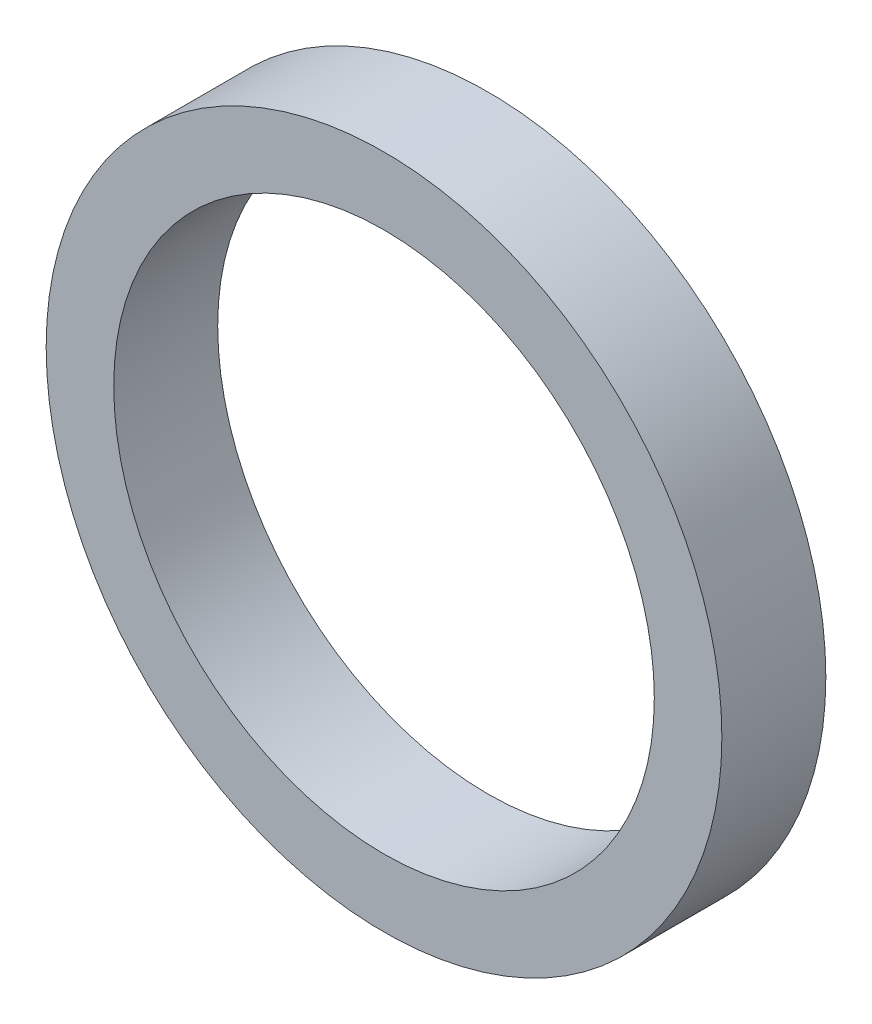
ISO-10303-21;
HEADER;
FILE_DESCRIPTION(('STEP AP214'),'2;1');
FILE_NAME('part.step','',(''),(''),'','','');
FILE_SCHEMA(('AUTOMOTIVE_DESIGN { 1 0 10303 214 1 1 1 1 }'));
ENDSEC;
DATA;
#1=APPLICATION_CONTEXT('core data for automotive mechanical design processes');
#2=APPLICATION_PROTOCOL_DEFINITION('international standard','automotive_design',2000,#1);
#3=PRODUCT_CONTEXT('',#1,'mechanical');
#4=PRODUCT('Part','Part','',(#3));
#5=PRODUCT_RELATED_PRODUCT_CATEGORY('part','',(#4));
#6=PRODUCT_DEFINITION_FORMATION('','',#4);
#7=PRODUCT_DEFINITION_CONTEXT('part definition',#1,'design');
#8=PRODUCT_DEFINITION('design','',#6,#7);
#9=PRODUCT_DEFINITION_SHAPE('','',#8);
#10=(LENGTH_UNIT() NAMED_UNIT(*) SI_UNIT(.MILLI.,.METRE.));
#11=(NAMED_UNIT(*) PLANE_ANGLE_UNIT() SI_UNIT($,.RADIAN.));
#12=(NAMED_UNIT(*) SI_UNIT($,.STERADIAN.) SOLID_ANGLE_UNIT());
#13=UNCERTAINTY_MEASURE_WITH_UNIT(LENGTH_MEASURE(1.E-05),#10,'distance_accuracy_value','');
#14=(GEOMETRIC_REPRESENTATION_CONTEXT(3) GLOBAL_UNCERTAINTY_ASSIGNED_CONTEXT((#13)) GLOBAL_UNIT_ASSIGNED_CONTEXT((#10,
#11,#12)) REPRESENTATION_CONTEXT('',''));
#15=CARTESIAN_POINT('',(0.,0.,0.));
#16=DIRECTION('',(0.,0.,1.));
#17=DIRECTION('',(1.,0.,0.));
#18=AXIS2_PLACEMENT_3D('',#15,#16,#17);
#19=CARTESIAN_POINT('',(33.,0.,4.));
#20=DIRECTION('',(0.,0.,1.));
#21=DIRECTION('',(1.,0.,0.));
#22=AXIS2_PLACEMENT_3D('',#19,#20,#21);
#23=PLANE('',#22);
#24=CARTESIAN_POINT('',(33.,0.,4.));
#25=DIRECTION('',(0.,0.,1.));
#26=DIRECTION('',(1.,0.,0.));
#27=AXIS2_PLACEMENT_3D('',#24,#25,#26);
#28=CIRCLE('',#27,3.25);
#29=CARTESIAN_POINT('',(36.25,0.,4.));
#30=VERTEX_POINT('',#29);
#31=EDGE_CURVE('E10',#30,#30,#28,.T.);
#32=ORIENTED_EDGE('',*,*,#31,.T.);
#33=EDGE_LOOP('',(#32));
#34=FACE_BOUND('',#33,.T.);
#35=CARTESIAN_POINT('',(33.,0.,4.));
#36=DIRECTION('',(0.,0.,1.));
#37=DIRECTION('',(1.,0.,0.));
#38=AXIS2_PLACEMENT_3D('',#35,#36,#37);
#39=CIRCLE('',#38,2.6);
#40=CARTESIAN_POINT('',(35.6,0.,4.));
#41=VERTEX_POINT('',#40);
#42=EDGE_CURVE('E48',#41,#41,#39,.T.);
#43=ORIENTED_EDGE('',*,*,#42,.F.);
#44=EDGE_LOOP('',(#43));
#45=FACE_BOUND('',#44,.T.);
#46=ADVANCED_FACE('F37',(#34,#45),#23,.T.);
#47=CARTESIAN_POINT('',(33.,0.,3.));
#48=DIRECTION('',(0.,0.,1.));
#49=DIRECTION('',(1.,0.,0.));
#50=AXIS2_PLACEMENT_3D('',#47,#48,#49);
#51=PLANE('',#50);
#52=CARTESIAN_POINT('',(33.,0.,3.));
#53=DIRECTION('',(0.,0.,1.));
#54=DIRECTION('',(1.,0.,0.));
#55=AXIS2_PLACEMENT_3D('',#52,#53,#54);
#56=CIRCLE('',#55,3.25);
#57=CARTESIAN_POINT('',(36.25,0.,3.));
#58=VERTEX_POINT('',#57);
#59=EDGE_CURVE('E41',#58,#58,#56,.T.);
#60=ORIENTED_EDGE('',*,*,#59,.F.);
#61=EDGE_LOOP('',(#60));
#62=FACE_BOUND('',#61,.T.);
#63=CARTESIAN_POINT('',(33.,0.,3.));
#64=DIRECTION('',(0.,0.,1.));
#65=DIRECTION('',(1.,0.,0.));
#66=AXIS2_PLACEMENT_3D('',#63,#64,#65);
#67=CIRCLE('',#66,2.6);
#68=CARTESIAN_POINT('',(35.6,0.,3.));
#69=VERTEX_POINT('',#68);
#70=EDGE_CURVE('E50',#69,#69,#67,.T.);
#71=ORIENTED_EDGE('',*,*,#70,.T.);
#72=EDGE_LOOP('',(#71));
#73=FACE_BOUND('',#72,.T.);
#74=ADVANCED_FACE('F60',(#62,#73),#51,.F.);
#75=CARTESIAN_POINT('',(33.,0.,4.));
#76=DIRECTION('',(0.,0.,-1.));
#77=DIRECTION('',(-1.,0.,0.));
#78=AXIS2_PLACEMENT_3D('',#75,#76,#77);
#79=CYLINDRICAL_SURFACE('',#78,3.25);
#80=ORIENTED_EDGE('',*,*,#31,.F.);
#81=EDGE_LOOP('',(#80));
#82=FACE_BOUND('',#81,.T.);
#83=ORIENTED_EDGE('',*,*,#59,.T.);
#84=EDGE_LOOP('',(#83));
#85=FACE_BOUND('',#84,.T.);
#86=ADVANCED_FACE('F39',(#82,#85),#79,.T.);
#87=CARTESIAN_POINT('',(33.,0.,4.));
#88=DIRECTION('',(0.,0.,-1.));
#89=DIRECTION('',(-1.,0.,0.));
#90=AXIS2_PLACEMENT_3D('',#87,#88,#89);
#91=CYLINDRICAL_SURFACE('',#90,2.6);
#92=ORIENTED_EDGE('',*,*,#42,.T.);
#93=EDGE_LOOP('',(#92));
#94=FACE_BOUND('',#93,.T.);
#95=ORIENTED_EDGE('',*,*,#70,.F.);
#96=EDGE_LOOP('',(#95));
#97=FACE_BOUND('',#96,.T.);
#98=ADVANCED_FACE('F56',(#94,#97),#91,.F.);
#99=CLOSED_SHELL('',(#46,#74,#86,#98));
#100=MANIFOLD_SOLID_BREP('B2',#99);
#101=ADVANCED_BREP_SHAPE_REPRESENTATION('',(#18,#100),#14);
#102=SHAPE_DEFINITION_REPRESENTATION(#9,#101);
ENDSEC;
END-ISO-10303-21;
